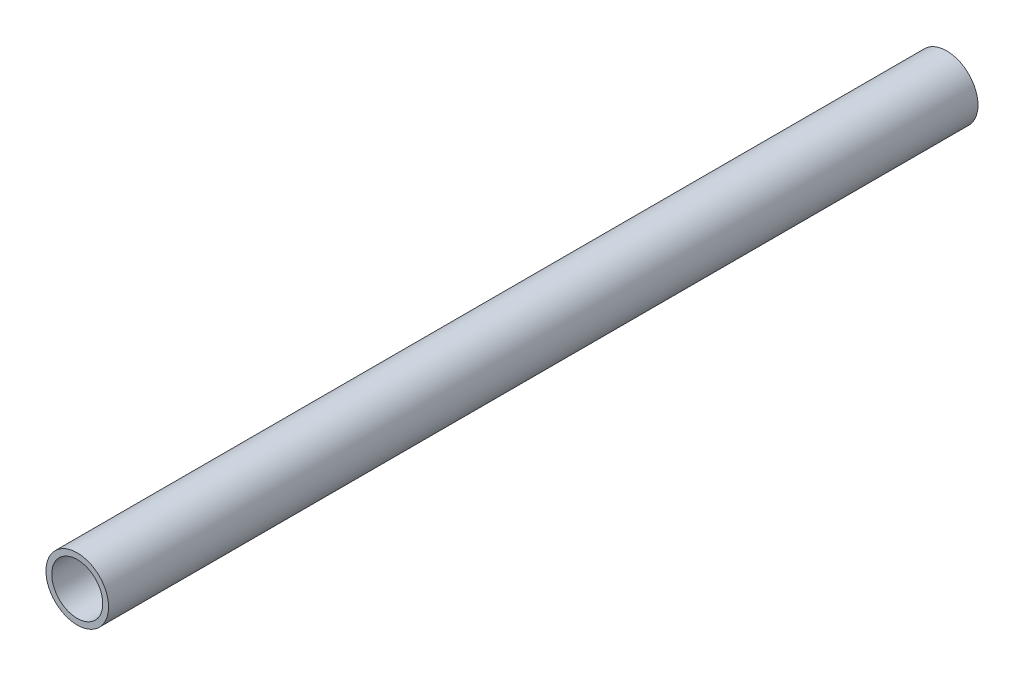
ISO-10303-21;
HEADER;
FILE_DESCRIPTION(('STEP AP214'),'2;1');
FILE_NAME('part.step','',(''),(''),'','','');
FILE_SCHEMA(('AUTOMOTIVE_DESIGN { 1 0 10303 214 1 1 1 1 }'));
ENDSEC;
DATA;
#1=APPLICATION_CONTEXT('core data for automotive mechanical design processes');
#2=APPLICATION_PROTOCOL_DEFINITION('international standard','automotive_design',2000,#1);
#3=PRODUCT_CONTEXT('',#1,'mechanical');
#4=PRODUCT('Part','Part','',(#3));
#5=PRODUCT_RELATED_PRODUCT_CATEGORY('part','',(#4));
#6=PRODUCT_DEFINITION_FORMATION('','',#4);
#7=PRODUCT_DEFINITION_CONTEXT('part definition',#1,'design');
#8=PRODUCT_DEFINITION('design','',#6,#7);
#9=PRODUCT_DEFINITION_SHAPE('','',#8);
#10=(LENGTH_UNIT() NAMED_UNIT(*) SI_UNIT(.MILLI.,.METRE.));
#11=(NAMED_UNIT(*) PLANE_ANGLE_UNIT() SI_UNIT($,.RADIAN.));
#12=(NAMED_UNIT(*) SI_UNIT($,.STERADIAN.) SOLID_ANGLE_UNIT());
#13=UNCERTAINTY_MEASURE_WITH_UNIT(LENGTH_MEASURE(1.E-05),#10,'distance_accuracy_value','');
#14=(GEOMETRIC_REPRESENTATION_CONTEXT(3) GLOBAL_UNCERTAINTY_ASSIGNED_CONTEXT((#13)) GLOBAL_UNIT_ASSIGNED_CONTEXT((#10,
#11,#12)) REPRESENTATION_CONTEXT('',''));
#15=CARTESIAN_POINT('',(0.,0.,0.));
#16=DIRECTION('',(0.,0.,1.));
#17=DIRECTION('',(1.,0.,0.));
#18=AXIS2_PLACEMENT_3D('',#15,#16,#17);
#19=CARTESIAN_POINT('',(0.,0.,300.));
#20=DIRECTION('',(0.,0.,1.));
#21=DIRECTION('',(1.,0.,0.));
#22=AXIS2_PLACEMENT_3D('',#19,#20,#21);
#23=PLANE('',#22);
#24=CARTESIAN_POINT('',(0.,0.,300.));
#25=DIRECTION('',(0.,0.,1.));
#26=DIRECTION('',(1.,0.,0.));
#27=AXIS2_PLACEMENT_3D('',#24,#25,#26);
#28=CIRCLE('',#27,10.8);
#29=CARTESIAN_POINT('',(10.8,0.,300.));
#30=VERTEX_POINT('',#29);
#31=EDGE_CURVE('E10',#30,#30,#28,.T.);
#32=ORIENTED_EDGE('',*,*,#31,.T.);
#33=EDGE_LOOP('',(#32));
#34=FACE_BOUND('',#33,.T.);
#35=CARTESIAN_POINT('',(0.,0.,300.));
#36=DIRECTION('',(0.,0.,1.));
#37=DIRECTION('',(1.,0.,0.));
#38=AXIS2_PLACEMENT_3D('',#35,#36,#37);
#39=CIRCLE('',#38,8.8);
#40=CARTESIAN_POINT('',(8.8,0.,300.));
#41=VERTEX_POINT('',#40);
#42=EDGE_CURVE('E50',#41,#41,#39,.T.);
#43=ORIENTED_EDGE('',*,*,#42,.F.);
#44=EDGE_LOOP('',(#43));
#45=FACE_BOUND('',#44,.T.);
#46=ADVANCED_FACE('F37',(#34,#45),#23,.T.);
#47=CARTESIAN_POINT('',(0.,0.,0.));
#48=DIRECTION('',(0.,0.,1.));
#49=DIRECTION('',(1.,0.,0.));
#50=AXIS2_PLACEMENT_3D('',#47,#48,#49);
#51=PLANE('',#50);
#52=CARTESIAN_POINT('',(0.,0.,0.));
#53=DIRECTION('',(0.,0.,1.));
#54=DIRECTION('',(1.,0.,0.));
#55=AXIS2_PLACEMENT_3D('',#52,#53,#54);
#56=CIRCLE('',#55,10.8);
#57=CARTESIAN_POINT('',(10.8,0.,0.));
#58=VERTEX_POINT('',#57);
#59=EDGE_CURVE('E41',#58,#58,#56,.T.);
#60=ORIENTED_EDGE('',*,*,#59,.F.);
#61=EDGE_LOOP('',(#60));
#62=FACE_BOUND('',#61,.T.);
#63=CARTESIAN_POINT('',(0.,0.,0.));
#64=DIRECTION('',(0.,0.,1.));
#65=DIRECTION('',(1.,0.,0.));
#66=AXIS2_PLACEMENT_3D('',#63,#64,#65);
#67=CIRCLE('',#66,8.8);
#68=CARTESIAN_POINT('',(8.8,0.,0.));
#69=VERTEX_POINT('',#68);
#70=EDGE_CURVE('E52',#69,#69,#67,.T.);
#71=ORIENTED_EDGE('',*,*,#70,.T.);
#72=EDGE_LOOP('',(#71));
#73=FACE_BOUND('',#72,.T.);
#74=ADVANCED_FACE('F64',(#62,#73),#51,.F.);
#75=CARTESIAN_POINT('',(0.,0.,300.));
#76=DIRECTION('',(0.,0.,-1.));
#77=DIRECTION('',(-1.,0.,0.));
#78=AXIS2_PLACEMENT_3D('',#75,#76,#77);
#79=CYLINDRICAL_SURFACE('',#78,10.8);
#80=ORIENTED_EDGE('',*,*,#31,.F.);
#81=EDGE_LOOP('',(#80));
#82=FACE_BOUND('',#81,.T.);
#83=ORIENTED_EDGE('',*,*,#59,.T.);
#84=EDGE_LOOP('',(#83));
#85=FACE_BOUND('',#84,.T.);
#86=ADVANCED_FACE('F39',(#82,#85),#79,.T.);
#87=CARTESIAN_POINT('',(0.,0.,300.));
#88=DIRECTION('',(0.,0.,-1.));
#89=DIRECTION('',(-1.,0.,0.));
#90=AXIS2_PLACEMENT_3D('',#87,#88,#89);
#91=CYLINDRICAL_SURFACE('',#90,8.8);
#92=ORIENTED_EDGE('',*,*,#42,.T.);
#93=EDGE_LOOP('',(#92));
#94=FACE_BOUND('',#93,.T.);
#95=ORIENTED_EDGE('',*,*,#70,.F.);
#96=EDGE_LOOP('',(#95));
#97=FACE_BOUND('',#96,.T.);
#98=ADVANCED_FACE('F60',(#94,#97),#91,.F.);
#99=CLOSED_SHELL('',(#46,#74,#86,#98));
#100=MANIFOLD_SOLID_BREP('B2',#99);
#101=ADVANCED_BREP_SHAPE_REPRESENTATION('',(#18,#100),#14);
#102=SHAPE_DEFINITION_REPRESENTATION(#9,#101);
ENDSEC;
END-ISO-10303-21;
